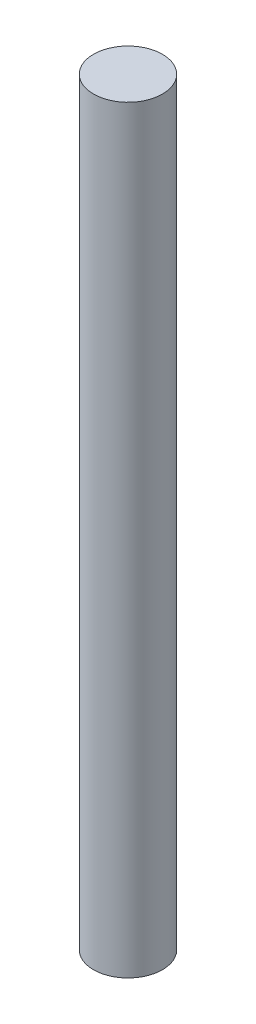
ISO-10303-21;
HEADER;
FILE_DESCRIPTION(('STEP AP214'),'2;1');
FILE_NAME('part.step','',(''),(''),'','','');
FILE_SCHEMA(('AUTOMOTIVE_DESIGN { 1 0 10303 214 1 1 1 1 }'));
ENDSEC;
DATA;
#1=APPLICATION_CONTEXT('core data for automotive mechanical design processes');
#2=APPLICATION_PROTOCOL_DEFINITION('international standard','automotive_design',2000,#1);
#3=PRODUCT_CONTEXT('',#1,'mechanical');
#4=PRODUCT('Part','Part','',(#3));
#5=PRODUCT_RELATED_PRODUCT_CATEGORY('part','',(#4));
#6=PRODUCT_DEFINITION_FORMATION('','',#4);
#7=PRODUCT_DEFINITION_CONTEXT('part definition',#1,'design');
#8=PRODUCT_DEFINITION('design','',#6,#7);
#9=PRODUCT_DEFINITION_SHAPE('','',#8);
#10=(LENGTH_UNIT() NAMED_UNIT(*) SI_UNIT(.MILLI.,.METRE.));
#11=(NAMED_UNIT(*) PLANE_ANGLE_UNIT() SI_UNIT($,.RADIAN.));
#12=(NAMED_UNIT(*) SI_UNIT($,.STERADIAN.) SOLID_ANGLE_UNIT());
#13=UNCERTAINTY_MEASURE_WITH_UNIT(LENGTH_MEASURE(1.E-05),#10,'distance_accuracy_value','');
#14=(GEOMETRIC_REPRESENTATION_CONTEXT(3) GLOBAL_UNCERTAINTY_ASSIGNED_CONTEXT((#13)) GLOBAL_UNIT_ASSIGNED_CONTEXT((#10,
#11,#12)) REPRESENTATION_CONTEXT('',''));
#15=CARTESIAN_POINT('',(0.,0.,0.));
#16=DIRECTION('',(0.,0.,1.));
#17=DIRECTION('',(1.,0.,0.));
#18=AXIS2_PLACEMENT_3D('',#15,#16,#17);
#19=CARTESIAN_POINT('',(0.,22.,0.));
#20=DIRECTION('',(0.,-1.,0.));
#21=DIRECTION('',(0.,0.,-1.));
#22=AXIS2_PLACEMENT_3D('',#19,#20,#21);
#23=CYLINDRICAL_SURFACE('',#22,1.);
#24=CARTESIAN_POINT('',(0.,22.,0.));
#25=DIRECTION('',(0.,1.,0.));
#26=DIRECTION('',(0.,0.,1.));
#27=AXIS2_PLACEMENT_3D('',#24,#25,#26);
#28=CIRCLE('',#27,1.);
#29=CARTESIAN_POINT('',(0.,22.,1.));
#30=VERTEX_POINT('',#29);
#31=EDGE_CURVE('E10',#30,#30,#28,.T.);
#32=ORIENTED_EDGE('',*,*,#31,.F.);
#33=EDGE_LOOP('',(#32));
#34=FACE_BOUND('',#33,.T.);
#35=CARTESIAN_POINT('',(0.,0.,0.));
#36=DIRECTION('',(0.,1.,0.));
#37=DIRECTION('',(0.,0.,1.));
#38=AXIS2_PLACEMENT_3D('',#35,#36,#37);
#39=CIRCLE('',#38,1.);
#40=CARTESIAN_POINT('',(0.,0.,1.));
#41=VERTEX_POINT('',#40);
#42=EDGE_CURVE('E40',#41,#41,#39,.T.);
#43=ORIENTED_EDGE('',*,*,#42,.T.);
#44=EDGE_LOOP('',(#43));
#45=FACE_BOUND('',#44,.T.);
#46=ADVANCED_FACE('F37',(#34,#45),#23,.T.);
#47=CARTESIAN_POINT('',(0.,22.,0.));
#48=DIRECTION('',(0.,1.,0.));
#49=DIRECTION('',(0.,0.,1.));
#50=AXIS2_PLACEMENT_3D('',#47,#48,#49);
#51=PLANE('',#50);
#52=ORIENTED_EDGE('',*,*,#31,.T.);
#53=EDGE_LOOP('',(#52));
#54=FACE_BOUND('',#53,.T.);
#55=ADVANCED_FACE('F54',(#54),#51,.T.);
#56=CARTESIAN_POINT('',(0.,0.,0.));
#57=DIRECTION('',(0.,1.,0.));
#58=DIRECTION('',(0.,0.,1.));
#59=AXIS2_PLACEMENT_3D('',#56,#57,#58);
#60=PLANE('',#59);
#61=ORIENTED_EDGE('',*,*,#42,.F.);
#62=EDGE_LOOP('',(#61));
#63=FACE_BOUND('',#62,.T.);
#64=ADVANCED_FACE('F52',(#63),#60,.F.);
#65=CLOSED_SHELL('',(#46,#55,#64));
#66=MANIFOLD_SOLID_BREP('B2',#65);
#67=ADVANCED_BREP_SHAPE_REPRESENTATION('',(#18,#66),#14);
#68=SHAPE_DEFINITION_REPRESENTATION(#9,#67);
ENDSEC;
END-ISO-10303-21;
